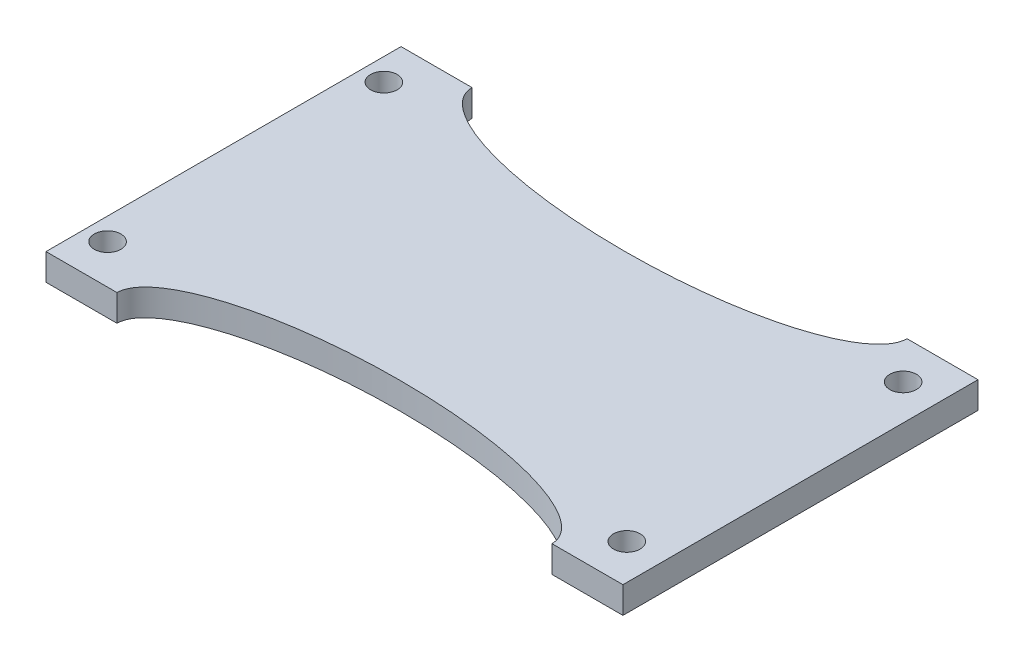
ISO-10303-21;
HEADER;
FILE_DESCRIPTION(('STEP AP214'),'2;1');
FILE_NAME('part.step','',(''),(''),'','','');
FILE_SCHEMA(('AUTOMOTIVE_DESIGN { 1 0 10303 214 1 1 1 1 }'));
ENDSEC;
DATA;
#1=APPLICATION_CONTEXT('core data for automotive mechanical design processes');
#2=APPLICATION_PROTOCOL_DEFINITION('international standard','automotive_design',2000,#1);
#3=PRODUCT_CONTEXT('',#1,'mechanical');
#4=PRODUCT('Part','Part','',(#3));
#5=PRODUCT_RELATED_PRODUCT_CATEGORY('part','',(#4));
#6=PRODUCT_DEFINITION_FORMATION('','',#4);
#7=PRODUCT_DEFINITION_CONTEXT('part definition',#1,'design');
#8=PRODUCT_DEFINITION('design','',#6,#7);
#9=PRODUCT_DEFINITION_SHAPE('','',#8);
#10=(LENGTH_UNIT() NAMED_UNIT(*) SI_UNIT(.MILLI.,.METRE.));
#11=(NAMED_UNIT(*) PLANE_ANGLE_UNIT() SI_UNIT($,.RADIAN.));
#12=(NAMED_UNIT(*) SI_UNIT($,.STERADIAN.) SOLID_ANGLE_UNIT());
#13=UNCERTAINTY_MEASURE_WITH_UNIT(LENGTH_MEASURE(1.E-05),#10,'distance_accuracy_value','');
#14=(GEOMETRIC_REPRESENTATION_CONTEXT(3) GLOBAL_UNCERTAINTY_ASSIGNED_CONTEXT((#13)) GLOBAL_UNIT_ASSIGNED_CONTEXT((#10,
#11,#12)) REPRESENTATION_CONTEXT('',''));
#15=CARTESIAN_POINT('',(0.,0.,0.));
#16=DIRECTION('',(0.,0.,1.));
#17=DIRECTION('',(1.,0.,0.));
#18=AXIS2_PLACEMENT_3D('',#15,#16,#17);
#19=CARTESIAN_POINT('',(-80.3673476966738,-47.9784941186156,58.0905987160941));
#20=DIRECTION('',(-1.,0.,0.));
#21=DIRECTION('',(0.,-1.,0.));
#22=AXIS2_PLACEMENT_3D('',#19,#20,#21);
#23=PLANE('',#22);
#24=DIRECTION('',(0.,0.,1.));
#25=VECTOR('',#24,1.);
#26=CARTESIAN_POINT('',(-80.3673476966738,-44.9784941186156,58.0905987160941));
#27=LINE('',#26,#25);
#28=CARTESIAN_POINT('',(-80.3673476966738,-44.9784941186156,58.0905987160941));
#29=VERTEX_POINT('',#28);
#30=CARTESIAN_POINT('',(-80.3673476966738,-44.9784941186156,98.0905987160905));
#31=VERTEX_POINT('',#30);
#32=EDGE_CURVE('E182',#29,#31,#27,.T.);
#33=ORIENTED_EDGE('',*,*,#32,.T.);
#34=DIRECTION('',(0.,1.,0.));
#35=VECTOR('',#34,1.);
#36=CARTESIAN_POINT('',(-80.3673476966738,-47.9784941186156,98.0905987160905));
#37=LINE('',#36,#35);
#38=CARTESIAN_POINT('',(-80.3673476966738,-47.9784941186156,98.0905987160905));
#39=VERTEX_POINT('',#38);
#40=EDGE_CURVE('E11',#39,#31,#37,.T.);
#41=ORIENTED_EDGE('',*,*,#40,.F.);
#42=DIRECTION('',(0.,0.,1.));
#43=VECTOR('',#42,1.);
#44=CARTESIAN_POINT('',(-80.3673476966738,-47.9784941186156,58.0905987160941));
#45=LINE('',#44,#43);
#46=CARTESIAN_POINT('',(-80.3673476966738,-47.9784941186156,58.0905987160941));
#47=VERTEX_POINT('',#46);
#48=EDGE_CURVE('E189',#47,#39,#45,.T.);
#49=ORIENTED_EDGE('',*,*,#48,.F.);
#50=DIRECTION('',(0.,1.,0.));
#51=VECTOR('',#50,1.);
#52=CARTESIAN_POINT('',(-80.3673476966738,-47.9784941186156,58.0905987160941));
#53=LINE('',#52,#51);
#54=EDGE_CURVE('E125',#47,#29,#53,.T.);
#55=ORIENTED_EDGE('',*,*,#54,.T.);
#56=EDGE_LOOP('',(#33,#41,#49,#55));
#57=FACE_BOUND('',#56,.T.);
#58=ADVANCED_FACE('F33',(#57),#23,.F.);
#59=CARTESIAN_POINT('',(-80.3673476966738,-47.9784941186156,98.0905987160905));
#60=DIRECTION('',(0.,0.,-1.));
#61=DIRECTION('',(0.,1.,0.));
#62=AXIS2_PLACEMENT_3D('',#59,#60,#61);
#63=PLANE('',#62);
#64=DIRECTION('',(-1.,0.,0.));
#65=VECTOR('',#64,1.);
#66=CARTESIAN_POINT('',(-80.3673476966738,-44.9784941186156,98.0905987160905));
#67=LINE('',#66,#65);
#68=CARTESIAN_POINT('',(-88.3673476966738,-44.9784941186156,98.0905987160905));
#69=VERTEX_POINT('',#68);
#70=EDGE_CURVE('E179',#31,#69,#67,.T.);
#71=ORIENTED_EDGE('',*,*,#70,.T.);
#72=DIRECTION('',(0.,1.,0.));
#73=VECTOR('',#72,1.);
#74=CARTESIAN_POINT('',(-88.3673476966738,-47.9784941186156,98.0905987160905));
#75=LINE('',#74,#73);
#76=CARTESIAN_POINT('',(-88.3673476966738,-47.9784941186156,98.0905987160905));
#77=VERTEX_POINT('',#76);
#78=EDGE_CURVE('E41',#77,#69,#75,.T.);
#79=ORIENTED_EDGE('',*,*,#78,.F.);
#80=DIRECTION('',(-1.,0.,0.));
#81=VECTOR('',#80,1.);
#82=CARTESIAN_POINT('',(-80.3673476966738,-47.9784941186156,98.0905987160905));
#83=LINE('',#82,#81);
#84=EDGE_CURVE('E92',#39,#77,#83,.T.);
#85=ORIENTED_EDGE('',*,*,#84,.F.);
#86=ORIENTED_EDGE('',*,*,#40,.T.);
#87=EDGE_LOOP('',(#71,#79,#85,#86));
#88=FACE_BOUND('',#87,.T.);
#89=ADVANCED_FACE('F149',(#88),#63,.F.);
#90=CARTESIAN_POINT('',(-112.867347696674,-47.9784941186156,98.0905987160905));
#91=DIRECTION('',(0.,1.,0.));
#92=DIRECTION('',(1.,0.,0.));
#93=AXIS2_PLACEMENT_3D('',#90,#91,#92);
#94=ELLIPSE('',#93,24.5,7.3805872975789);
#95=DIRECTION('',(0.,1.,0.));
#96=VECTOR('',#95,1.);
#97=SURFACE_OF_LINEAR_EXTRUSION('',#94,#96);
#98=CARTESIAN_POINT('',(-112.867347696674,-44.9784941186156,98.0905987160905));
#99=DIRECTION('',(0.,1.,0.));
#100=DIRECTION('',(1.,0.,0.));
#101=AXIS2_PLACEMENT_3D('',#98,#99,#100);
#102=ELLIPSE('',#101,24.5,7.3805872975789);
#103=CARTESIAN_POINT('',(-137.367347696674,-44.9784941186156,98.0905987160905));
#104=VERTEX_POINT('',#103);
#105=EDGE_CURVE('E175',#69,#104,#102,.T.);
#106=ORIENTED_EDGE('',*,*,#105,.T.);
#107=DIRECTION('',(0.,1.,0.));
#108=VECTOR('',#107,1.);
#109=CARTESIAN_POINT('',(-137.367347696674,-47.9784941186156,98.0905987160905));
#110=LINE('',#109,#108);
#111=CARTESIAN_POINT('',(-137.367347696674,-47.9784941186156,98.0905987160905));
#112=VERTEX_POINT('',#111);
#113=EDGE_CURVE('E167',#112,#104,#110,.T.);
#114=ORIENTED_EDGE('',*,*,#113,.F.);
#115=EDGE_CURVE('E151',#77,#112,#94,.T.);
#116=ORIENTED_EDGE('',*,*,#115,.F.);
#117=ORIENTED_EDGE('',*,*,#78,.T.);
#118=EDGE_LOOP('',(#106,#114,#116,#117));
#119=FACE_BOUND('',#118,.T.);
#120=ADVANCED_FACE('F145',(#119),#97,.F.);
#121=CARTESIAN_POINT('',(-137.367347696674,-47.9784941186156,98.0905987160905));
#122=DIRECTION('',(-4.63171168085809E-13,0.,-1.));
#123=DIRECTION('',(-1.,0.,4.63171168085809E-13));
#124=AXIS2_PLACEMENT_3D('',#121,#122,#123);
#125=PLANE('',#124);
#126=DIRECTION('',(-1.,0.,4.63171168085809E-13));
#127=VECTOR('',#126,1.);
#128=CARTESIAN_POINT('',(-137.367347696674,-44.9784941186156,98.0905987160905));
#129=LINE('',#128,#127);
#130=CARTESIAN_POINT('',(-145.367347696674,-44.9784941186156,98.0905987160942));
#131=VERTEX_POINT('',#130);
#132=EDGE_CURVE('E165',#104,#131,#129,.T.);
#133=ORIENTED_EDGE('',*,*,#132,.T.);
#134=DIRECTION('',(0.,1.,0.));
#135=VECTOR('',#134,1.);
#136=CARTESIAN_POINT('',(-145.367347696674,-47.9784941186156,98.0905987160942));
#137=LINE('',#136,#135);
#138=CARTESIAN_POINT('',(-145.367347696674,-47.9784941186156,98.0905987160942));
#139=VERTEX_POINT('',#138);
#140=EDGE_CURVE('E163',#139,#131,#137,.T.);
#141=ORIENTED_EDGE('',*,*,#140,.F.);
#142=DIRECTION('',(-1.,0.,4.63171168085809E-13));
#143=VECTOR('',#142,1.);
#144=CARTESIAN_POINT('',(-137.367347696674,-47.9784941186156,98.0905987160905));
#145=LINE('',#144,#143);
#146=EDGE_CURVE('E155',#112,#139,#145,.T.);
#147=ORIENTED_EDGE('',*,*,#146,.F.);
#148=ORIENTED_EDGE('',*,*,#113,.T.);
#149=EDGE_LOOP('',(#133,#141,#147,#148));
#150=FACE_BOUND('',#149,.T.);
#151=ADVANCED_FACE('F141',(#150),#125,.F.);
#152=CARTESIAN_POINT('',(-145.367347696674,-47.9784941186156,58.0905987160904));
#153=DIRECTION('',(1.,0.,0.));
#154=DIRECTION('',(0.,1.,0.));
#155=AXIS2_PLACEMENT_3D('',#152,#153,#154);
#156=PLANE('',#155);
#157=DIRECTION('',(0.,0.,-1.));
#158=VECTOR('',#157,1.);
#159=CARTESIAN_POINT('',(-145.367347696674,-44.9784941186156,58.0905987160904));
#160=LINE('',#159,#158);
#161=CARTESIAN_POINT('',(-145.367347696674,-44.9784941186156,58.0905987160904));
#162=VERTEX_POINT('',#161);
#163=EDGE_CURVE('E169',#131,#162,#160,.T.);
#164=ORIENTED_EDGE('',*,*,#163,.T.);
#165=DIRECTION('',(0.,1.,0.));
#166=VECTOR('',#165,1.);
#167=CARTESIAN_POINT('',(-145.367347696674,-47.9784941186156,58.0905987160904));
#168=LINE('',#167,#166);
#169=CARTESIAN_POINT('',(-145.367347696674,-47.9784941186156,58.0905987160904));
#170=VERTEX_POINT('',#169);
#171=EDGE_CURVE('E120',#170,#162,#168,.T.);
#172=ORIENTED_EDGE('',*,*,#171,.F.);
#173=DIRECTION('',(0.,0.,-1.));
#174=VECTOR('',#173,1.);
#175=CARTESIAN_POINT('',(-145.367347696674,-47.9784941186156,58.0905987160904));
#176=LINE('',#175,#174);
#177=EDGE_CURVE('E111',#139,#170,#176,.T.);
#178=ORIENTED_EDGE('',*,*,#177,.F.);
#179=ORIENTED_EDGE('',*,*,#140,.T.);
#180=EDGE_LOOP('',(#164,#172,#178,#179));
#181=FACE_BOUND('',#180,.T.);
#182=ADVANCED_FACE('F138',(#181),#156,.F.);
#183=CARTESIAN_POINT('',(-137.367347696674,-47.9784941186156,58.0905987160941));
#184=DIRECTION('',(-4.63171168085809E-13,0.,1.));
#185=DIRECTION('',(1.,0.,4.63171168085809E-13));
#186=AXIS2_PLACEMENT_3D('',#183,#184,#185);
#187=PLANE('',#186);
#188=DIRECTION('',(1.,0.,4.63171168085809E-13));
#189=VECTOR('',#188,1.);
#190=CARTESIAN_POINT('',(-137.367347696674,-44.9784941186156,58.0905987160941));
#191=LINE('',#190,#189);
#192=CARTESIAN_POINT('',(-137.367347696674,-44.9784941186156,58.0905987160941));
#193=VERTEX_POINT('',#192);
#194=EDGE_CURVE('E119',#162,#193,#191,.T.);
#195=ORIENTED_EDGE('',*,*,#194,.T.);
#196=DIRECTION('',(0.,1.,0.));
#197=VECTOR('',#196,1.);
#198=CARTESIAN_POINT('',(-137.367347696674,-47.9784941186156,58.0905987160941));
#199=LINE('',#198,#197);
#200=CARTESIAN_POINT('',(-137.367347696674,-47.9784941186156,58.0905987160941));
#201=VERTEX_POINT('',#200);
#202=EDGE_CURVE('E116',#201,#193,#199,.T.);
#203=ORIENTED_EDGE('',*,*,#202,.F.);
#204=DIRECTION('',(1.,0.,4.63171168085809E-13));
#205=VECTOR('',#204,1.);
#206=CARTESIAN_POINT('',(-137.367347696674,-47.9784941186156,58.0905987160941));
#207=LINE('',#206,#205);
#208=EDGE_CURVE('E105',#170,#201,#207,.T.);
#209=ORIENTED_EDGE('',*,*,#208,.F.);
#210=ORIENTED_EDGE('',*,*,#171,.T.);
#211=EDGE_LOOP('',(#195,#203,#209,#210));
#212=FACE_BOUND('',#211,.T.);
#213=ADVANCED_FACE('F117',(#212),#187,.F.);
#214=CARTESIAN_POINT('',(-112.867347696674,-47.9784941186156,58.0905987160941));
#215=DIRECTION('',(0.,1.,0.));
#216=DIRECTION('',(1.,0.,0.));
#217=AXIS2_PLACEMENT_3D('',#214,#215,#216);
#218=ELLIPSE('',#217,24.5,7.38058729757891);
#219=DIRECTION('',(0.,1.,0.));
#220=VECTOR('',#219,1.);
#221=SURFACE_OF_LINEAR_EXTRUSION('',#218,#220);
#222=CARTESIAN_POINT('',(-112.867347696674,-44.9784941186156,58.0905987160941));
#223=DIRECTION('',(0.,1.,0.));
#224=DIRECTION('',(1.,0.,0.));
#225=AXIS2_PLACEMENT_3D('',#222,#223,#224);
#226=ELLIPSE('',#225,24.5,7.38058729757891);
#227=CARTESIAN_POINT('',(-88.3673476966738,-44.9784941186156,58.0905987160941));
#228=VERTEX_POINT('',#227);
#229=EDGE_CURVE('E78',#193,#228,#226,.T.);
#230=ORIENTED_EDGE('',*,*,#229,.T.);
#231=DIRECTION('',(0.,1.,0.));
#232=VECTOR('',#231,1.);
#233=CARTESIAN_POINT('',(-88.3673476966738,-47.9784941186156,58.0905987160941));
#234=LINE('',#233,#232);
#235=CARTESIAN_POINT('',(-88.3673476966738,-47.9784941186156,58.0905987160941));
#236=VERTEX_POINT('',#235);
#237=EDGE_CURVE('E121',#236,#228,#234,.T.);
#238=ORIENTED_EDGE('',*,*,#237,.F.);
#239=EDGE_CURVE('E109',#201,#236,#218,.T.);
#240=ORIENTED_EDGE('',*,*,#239,.F.);
#241=ORIENTED_EDGE('',*,*,#202,.T.);
#242=EDGE_LOOP('',(#230,#238,#240,#241));
#243=FACE_BOUND('',#242,.T.);
#244=ADVANCED_FACE('F123',(#243),#221,.F.);
#245=CARTESIAN_POINT('',(-80.3673476966738,-47.9784941186156,58.0905987160941));
#246=DIRECTION('',(0.,0.,1.));
#247=DIRECTION('',(0.,-1.,0.));
#248=AXIS2_PLACEMENT_3D('',#245,#246,#247);
#249=PLANE('',#248);
#250=DIRECTION('',(1.,0.,0.));
#251=VECTOR('',#250,1.);
#252=CARTESIAN_POINT('',(-80.3673476966738,-44.9784941186156,58.0905987160941));
#253=LINE('',#252,#251);
#254=EDGE_CURVE('E84',#228,#29,#253,.T.);
#255=ORIENTED_EDGE('',*,*,#254,.T.);
#256=ORIENTED_EDGE('',*,*,#54,.F.);
#257=DIRECTION('',(1.,0.,0.));
#258=VECTOR('',#257,1.);
#259=CARTESIAN_POINT('',(-80.3673476966738,-47.9784941186156,58.0905987160941));
#260=LINE('',#259,#258);
#261=EDGE_CURVE('E49',#236,#47,#260,.T.);
#262=ORIENTED_EDGE('',*,*,#261,.F.);
#263=ORIENTED_EDGE('',*,*,#237,.T.);
#264=EDGE_LOOP('',(#255,#256,#262,#263));
#265=FACE_BOUND('',#264,.T.);
#266=ADVANCED_FACE('F134',(#265),#249,.F.);
#267=CARTESIAN_POINT('',(-112.867347696674,-47.9784941186156,98.0905987160905));
#268=DIRECTION('',(0.,1.,0.));
#269=DIRECTION('',(0.,0.,1.));
#270=AXIS2_PLACEMENT_3D('',#267,#268,#269);
#271=PLANE('',#270);
#272=CARTESIAN_POINT('',(-142.867347696674,-47.9784941186156,62.5261235705747));
#273=DIRECTION('',(0.,-1.,0.));
#274=DIRECTION('',(0.,0.,1.));
#275=AXIS2_PLACEMENT_3D('',#272,#273,#274);
#276=CIRCLE('',#275,1.49999999999783);
#277=CARTESIAN_POINT('',(-142.867347696674,-47.9784941186156,64.0261235705725));
#278=VERTEX_POINT('',#277);
#279=EDGE_CURVE('E320',#278,#278,#276,.T.);
#280=ORIENTED_EDGE('',*,*,#279,.F.);
#281=EDGE_LOOP('',(#280));
#282=FACE_BOUND('',#281,.T.);
#283=CARTESIAN_POINT('',(-142.867347696674,-47.9784941186156,93.6550738616062));
#284=DIRECTION('',(0.,-1.,0.));
#285=DIRECTION('',(0.,0.,-1.));
#286=AXIS2_PLACEMENT_3D('',#283,#284,#285);
#287=CIRCLE('',#286,1.5);
#288=CARTESIAN_POINT('',(-142.867347696674,-47.9784941186156,92.1550738616062));
#289=VERTEX_POINT('',#288);
#290=EDGE_CURVE('E322',#289,#289,#287,.T.);
#291=ORIENTED_EDGE('',*,*,#290,.F.);
#292=EDGE_LOOP('',(#291));
#293=FACE_BOUND('',#292,.T.);
#294=CARTESIAN_POINT('',(-84.3673476966738,-47.9784941186156,62.5261235705747));
#295=DIRECTION('',(0.,-1.,0.));
#296=DIRECTION('',(0.,0.,1.));
#297=AXIS2_PLACEMENT_3D('',#294,#295,#296);
#298=CIRCLE('',#297,1.49999999999783);
#299=CARTESIAN_POINT('',(-84.3673476966738,-47.9784941186156,64.0261235705725));
#300=VERTEX_POINT('',#299);
#301=EDGE_CURVE('E203',#300,#300,#298,.T.);
#302=ORIENTED_EDGE('',*,*,#301,.F.);
#303=EDGE_LOOP('',(#302));
#304=FACE_BOUND('',#303,.T.);
#305=CARTESIAN_POINT('',(-84.3673476966738,-47.9784941186156,93.6550738616062));
#306=DIRECTION('',(0.,-1.,0.));
#307=DIRECTION('',(0.,0.,-1.));
#308=AXIS2_PLACEMENT_3D('',#305,#306,#307);
#309=CIRCLE('',#308,1.5);
#310=CARTESIAN_POINT('',(-84.3673476966738,-47.9784941186156,92.1550738616062));
#311=VERTEX_POINT('',#310);
#312=EDGE_CURVE('E195',#311,#311,#309,.T.);
#313=ORIENTED_EDGE('',*,*,#312,.F.);
#314=EDGE_LOOP('',(#313));
#315=FACE_BOUND('',#314,.T.);
#316=ORIENTED_EDGE('',*,*,#48,.T.);
#317=ORIENTED_EDGE('',*,*,#84,.T.);
#318=ORIENTED_EDGE('',*,*,#115,.T.);
#319=ORIENTED_EDGE('',*,*,#146,.T.);
#320=ORIENTED_EDGE('',*,*,#177,.T.);
#321=ORIENTED_EDGE('',*,*,#208,.T.);
#322=ORIENTED_EDGE('',*,*,#239,.T.);
#323=ORIENTED_EDGE('',*,*,#261,.T.);
#324=EDGE_LOOP('',(#316,#317,#318,#319,#320,#321,#322,#323));
#325=FACE_BOUND('',#324,.T.);
#326=ADVANCED_FACE('F107',(#282,#293,#304,#315,#325),#271,.F.);
#327=CARTESIAN_POINT('',(-112.867347696674,-44.9784941186156,98.0905987160905));
#328=DIRECTION('',(0.,1.,0.));
#329=DIRECTION('',(0.,0.,1.));
#330=AXIS2_PLACEMENT_3D('',#327,#328,#329);
#331=PLANE('',#330);
#332=CARTESIAN_POINT('',(-142.867347696674,-44.9784941186156,62.5261235705747));
#333=DIRECTION('',(0.,-1.,0.));
#334=DIRECTION('',(0.,0.,1.));
#335=AXIS2_PLACEMENT_3D('',#332,#333,#334);
#336=CIRCLE('',#335,1.49999999999783);
#337=CARTESIAN_POINT('',(-142.867347696674,-44.9784941186156,64.0261235705725));
#338=VERTEX_POINT('',#337);
#339=EDGE_CURVE('E317',#338,#338,#336,.T.);
#340=ORIENTED_EDGE('',*,*,#339,.T.);
#341=EDGE_LOOP('',(#340));
#342=FACE_BOUND('',#341,.T.);
#343=CARTESIAN_POINT('',(-142.867347696674,-44.9784941186156,93.6550738616062));
#344=DIRECTION('',(0.,-1.,0.));
#345=DIRECTION('',(0.,0.,-1.));
#346=AXIS2_PLACEMENT_3D('',#343,#344,#345);
#347=CIRCLE('',#346,1.5);
#348=CARTESIAN_POINT('',(-142.867347696674,-44.9784941186156,92.1550738616062));
#349=VERTEX_POINT('',#348);
#350=EDGE_CURVE('E325',#349,#349,#347,.T.);
#351=ORIENTED_EDGE('',*,*,#350,.T.);
#352=EDGE_LOOP('',(#351));
#353=FACE_BOUND('',#352,.T.);
#354=CARTESIAN_POINT('',(-84.3673476966738,-44.9784941186156,62.5261235705747));
#355=DIRECTION('',(0.,-1.,0.));
#356=DIRECTION('',(0.,0.,1.));
#357=AXIS2_PLACEMENT_3D('',#354,#355,#356);
#358=CIRCLE('',#357,1.49999999999783);
#359=CARTESIAN_POINT('',(-84.3673476966738,-44.9784941186156,64.0261235705725));
#360=VERTEX_POINT('',#359);
#361=EDGE_CURVE('E200',#360,#360,#358,.T.);
#362=ORIENTED_EDGE('',*,*,#361,.T.);
#363=EDGE_LOOP('',(#362));
#364=FACE_BOUND('',#363,.T.);
#365=CARTESIAN_POINT('',(-84.3673476966738,-44.9784941186156,93.6550738616062));
#366=DIRECTION('',(0.,-1.,0.));
#367=DIRECTION('',(0.,0.,-1.));
#368=AXIS2_PLACEMENT_3D('',#365,#366,#367);
#369=CIRCLE('',#368,1.5);
#370=CARTESIAN_POINT('',(-84.3673476966738,-44.9784941186156,92.1550738616062));
#371=VERTEX_POINT('',#370);
#372=EDGE_CURVE('E193',#371,#371,#369,.T.);
#373=ORIENTED_EDGE('',*,*,#372,.T.);
#374=EDGE_LOOP('',(#373));
#375=FACE_BOUND('',#374,.T.);
#376=ORIENTED_EDGE('',*,*,#32,.F.);
#377=ORIENTED_EDGE('',*,*,#254,.F.);
#378=ORIENTED_EDGE('',*,*,#229,.F.);
#379=ORIENTED_EDGE('',*,*,#194,.F.);
#380=ORIENTED_EDGE('',*,*,#163,.F.);
#381=ORIENTED_EDGE('',*,*,#132,.F.);
#382=ORIENTED_EDGE('',*,*,#105,.F.);
#383=ORIENTED_EDGE('',*,*,#70,.F.);
#384=EDGE_LOOP('',(#376,#377,#378,#379,#380,#381,#382,#383));
#385=FACE_BOUND('',#384,.T.);
#386=ADVANCED_FACE('F178',(#342,#353,#364,#375,#385),#331,.T.);
#387=CARTESIAN_POINT('',(-84.3673476966738,-44.9784941186156,93.6550738616062));
#388=DIRECTION('',(0.,-1.,0.));
#389=DIRECTION('',(0.,0.,-1.));
#390=AXIS2_PLACEMENT_3D('',#387,#388,#389);
#391=CYLINDRICAL_SURFACE('',#390,1.5);
#392=ORIENTED_EDGE('',*,*,#372,.F.);
#393=EDGE_LOOP('',(#392));
#394=FACE_BOUND('',#393,.T.);
#395=ORIENTED_EDGE('',*,*,#312,.T.);
#396=EDGE_LOOP('',(#395));
#397=FACE_BOUND('',#396,.T.);
#398=ADVANCED_FACE('F271',(#394,#397),#391,.F.);
#399=CARTESIAN_POINT('',(-84.3673476966738,-44.9784941186156,62.5261235705747));
#400=DIRECTION('',(0.,-1.,0.));
#401=DIRECTION('',(0.,0.,-1.));
#402=AXIS2_PLACEMENT_3D('',#399,#400,#401);
#403=CYLINDRICAL_SURFACE('',#402,1.49999999999783);
#404=ORIENTED_EDGE('',*,*,#361,.F.);
#405=EDGE_LOOP('',(#404));
#406=FACE_BOUND('',#405,.T.);
#407=ORIENTED_EDGE('',*,*,#301,.T.);
#408=EDGE_LOOP('',(#407));
#409=FACE_BOUND('',#408,.T.);
#410=ADVANCED_FACE('F280',(#406,#409),#403,.F.);
#411=CARTESIAN_POINT('',(-142.867347696674,-44.9784941186156,93.6550738616062));
#412=DIRECTION('',(0.,-1.,0.));
#413=DIRECTION('',(0.,0.,-1.));
#414=AXIS2_PLACEMENT_3D('',#411,#412,#413);
#415=CYLINDRICAL_SURFACE('',#414,1.5);
#416=ORIENTED_EDGE('',*,*,#350,.F.);
#417=EDGE_LOOP('',(#416));
#418=FACE_BOUND('',#417,.T.);
#419=ORIENTED_EDGE('',*,*,#290,.T.);
#420=EDGE_LOOP('',(#419));
#421=FACE_BOUND('',#420,.T.);
#422=ADVANCED_FACE('F290',(#418,#421),#415,.F.);
#423=CARTESIAN_POINT('',(-142.867347696674,-44.9784941186156,62.5261235705747));
#424=DIRECTION('',(0.,-1.,0.));
#425=DIRECTION('',(0.,0.,-1.));
#426=AXIS2_PLACEMENT_3D('',#423,#424,#425);
#427=CYLINDRICAL_SURFACE('',#426,1.49999999999783);
#428=ORIENTED_EDGE('',*,*,#339,.F.);
#429=EDGE_LOOP('',(#428));
#430=FACE_BOUND('',#429,.T.);
#431=ORIENTED_EDGE('',*,*,#279,.T.);
#432=EDGE_LOOP('',(#431));
#433=FACE_BOUND('',#432,.T.);
#434=ADVANCED_FACE('F300',(#430,#433),#427,.F.);
#435=CLOSED_SHELL('',(#58,#89,#120,#151,#182,#213,#244,#266,#326,#386,#398,#410,#422,#434));
#436=MANIFOLD_SOLID_BREP('B2',#435);
#437=ADVANCED_BREP_SHAPE_REPRESENTATION('',(#18,#436),#14);
#438=SHAPE_DEFINITION_REPRESENTATION(#9,#437);
ENDSEC;
END-ISO-10303-21;
